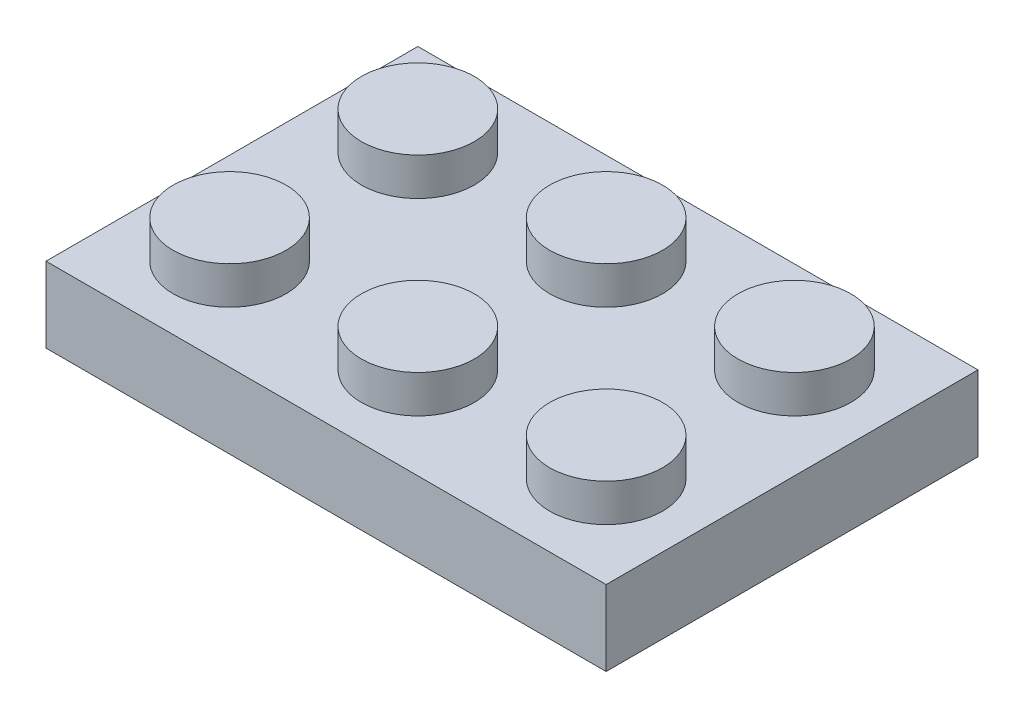
ISO-10303-21;
HEADER;
FILE_DESCRIPTION(('STEP AP214'),'2;1');
FILE_NAME('part.step','',(''),(''),'','','');
FILE_SCHEMA(('AUTOMOTIVE_DESIGN { 1 0 10303 214 1 1 1 1 }'));
ENDSEC;
DATA;
#1=APPLICATION_CONTEXT('core data for automotive mechanical design processes');
#2=APPLICATION_PROTOCOL_DEFINITION('international standard','automotive_design',2000,#1);
#3=PRODUCT_CONTEXT('',#1,'mechanical');
#4=PRODUCT('Part','Part','',(#3));
#5=PRODUCT_RELATED_PRODUCT_CATEGORY('part','',(#4));
#6=PRODUCT_DEFINITION_FORMATION('','',#4);
#7=PRODUCT_DEFINITION_CONTEXT('part definition',#1,'design');
#8=PRODUCT_DEFINITION('design','',#6,#7);
#9=PRODUCT_DEFINITION_SHAPE('','',#8);
#10=(LENGTH_UNIT() NAMED_UNIT(*) SI_UNIT(.MILLI.,.METRE.));
#11=(NAMED_UNIT(*) PLANE_ANGLE_UNIT() SI_UNIT($,.RADIAN.));
#12=(NAMED_UNIT(*) SI_UNIT($,.STERADIAN.) SOLID_ANGLE_UNIT());
#13=UNCERTAINTY_MEASURE_WITH_UNIT(LENGTH_MEASURE(1.E-05),#10,'distance_accuracy_value','');
#14=(GEOMETRIC_REPRESENTATION_CONTEXT(3) GLOBAL_UNCERTAINTY_ASSIGNED_CONTEXT((#13)) GLOBAL_UNIT_ASSIGNED_CONTEXT((#10,
#11,#12)) REPRESENTATION_CONTEXT('',''));
#15=CARTESIAN_POINT('',(0.,0.,0.));
#16=DIRECTION('',(0.,0.,1.));
#17=DIRECTION('',(1.,0.,0.));
#18=AXIS2_PLACEMENT_3D('',#15,#16,#17);
#19=CARTESIAN_POINT('',(0.,0.,-15.8));
#20=DIRECTION('',(0.,-1.,0.));
#21=DIRECTION('',(0.,0.,-1.));
#22=AXIS2_PLACEMENT_3D('',#19,#20,#21);
#23=PLANE('',#22);
#24=DIRECTION('',(1.,0.,0.));
#25=VECTOR('',#24,1.);
#26=CARTESIAN_POINT('',(0.,0.,0.));
#27=LINE('',#26,#25);
#28=CARTESIAN_POINT('',(0.,0.,0.));
#29=VERTEX_POINT('',#28);
#30=CARTESIAN_POINT('',(23.8,0.,0.));
#31=VERTEX_POINT('',#30);
#32=EDGE_CURVE('E205',#29,#31,#27,.T.);
#33=ORIENTED_EDGE('',*,*,#32,.F.);
#34=DIRECTION('',(0.,0.,1.));
#35=VECTOR('',#34,1.);
#36=CARTESIAN_POINT('',(0.,0.,-15.8));
#37=LINE('',#36,#35);
#38=CARTESIAN_POINT('',(0.,0.,-15.8));
#39=VERTEX_POINT('',#38);
#40=EDGE_CURVE('E88',#39,#29,#37,.T.);
#41=ORIENTED_EDGE('',*,*,#40,.F.);
#42=DIRECTION('',(1.,0.,0.));
#43=VECTOR('',#42,1.);
#44=CARTESIAN_POINT('',(0.,0.,-15.8));
#45=LINE('',#44,#43);
#46=CARTESIAN_POINT('',(23.8,0.,-15.8));
#47=VERTEX_POINT('',#46);
#48=EDGE_CURVE('E195',#39,#47,#45,.T.);
#49=ORIENTED_EDGE('',*,*,#48,.T.);
#50=DIRECTION('',(0.,0.,1.));
#51=VECTOR('',#50,1.);
#52=CARTESIAN_POINT('',(23.8,0.,-15.8));
#53=LINE('',#52,#51);
#54=EDGE_CURVE('E217',#47,#31,#53,.T.);
#55=ORIENTED_EDGE('',*,*,#54,.T.);
#56=EDGE_LOOP('',(#33,#41,#49,#55));
#57=FACE_BOUND('',#56,.T.);
#58=DIRECTION('',(0.,0.,1.));
#59=VECTOR('',#58,1.);
#60=CARTESIAN_POINT('',(1.2,0.,-15.8));
#61=LINE('',#60,#59);
#62=CARTESIAN_POINT('',(1.2,0.,-14.6));
#63=VERTEX_POINT('',#62);
#64=CARTESIAN_POINT('',(1.2,0.,-1.2));
#65=VERTEX_POINT('',#64);
#66=EDGE_CURVE('E133',#63,#65,#61,.T.);
#67=ORIENTED_EDGE('',*,*,#66,.T.);
#68=DIRECTION('',(1.,0.,0.));
#69=VECTOR('',#68,1.);
#70=CARTESIAN_POINT('',(0.,0.,-1.2));
#71=LINE('',#70,#69);
#72=CARTESIAN_POINT('',(22.6,0.,-1.2));
#73=VERTEX_POINT('',#72);
#74=EDGE_CURVE('E162',#65,#73,#71,.T.);
#75=ORIENTED_EDGE('',*,*,#74,.T.);
#76=DIRECTION('',(0.,0.,1.));
#77=VECTOR('',#76,1.);
#78=CARTESIAN_POINT('',(22.6,0.,-15.8));
#79=LINE('',#78,#77);
#80=CARTESIAN_POINT('',(22.6,0.,-14.6));
#81=VERTEX_POINT('',#80);
#82=EDGE_CURVE('E124',#81,#73,#79,.T.);
#83=ORIENTED_EDGE('',*,*,#82,.F.);
#84=DIRECTION('',(1.,0.,0.));
#85=VECTOR('',#84,1.);
#86=CARTESIAN_POINT('',(0.,0.,-14.6));
#87=LINE('',#86,#85);
#88=EDGE_CURVE('E53',#63,#81,#87,.T.);
#89=ORIENTED_EDGE('',*,*,#88,.F.);
#90=EDGE_LOOP('',(#67,#75,#83,#89));
#91=FACE_BOUND('',#90,.T.);
#92=ADVANCED_FACE('F38',(#57,#91),#23,.T.);
#93=CARTESIAN_POINT('',(19.9,4.8,-11.9));
#94=DIRECTION('',(0.,1.,0.));
#95=DIRECTION('',(0.,0.,1.));
#96=AXIS2_PLACEMENT_3D('',#93,#94,#95);
#97=PLANE('',#96);
#98=CARTESIAN_POINT('',(19.9,4.8,-11.9));
#99=DIRECTION('',(0.,1.,0.));
#100=DIRECTION('',(0.,0.,1.));
#101=AXIS2_PLACEMENT_3D('',#98,#99,#100);
#102=CIRCLE('',#101,2.4);
#103=CARTESIAN_POINT('',(19.9,4.8,-9.5));
#104=VERTEX_POINT('',#103);
#105=EDGE_CURVE('E240',#104,#104,#102,.T.);
#106=ORIENTED_EDGE('',*,*,#105,.T.);
#107=EDGE_LOOP('',(#106));
#108=FACE_BOUND('',#107,.T.);
#109=ADVANCED_FACE('F40',(#108),#97,.T.);
#110=CARTESIAN_POINT('',(19.9,4.8,-11.9));
#111=DIRECTION('',(0.,-1.,0.));
#112=DIRECTION('',(0.,0.,-1.));
#113=AXIS2_PLACEMENT_3D('',#110,#111,#112);
#114=CYLINDRICAL_SURFACE('',#113,2.4);
#115=ORIENTED_EDGE('',*,*,#105,.F.);
#116=EDGE_LOOP('',(#115));
#117=FACE_BOUND('',#116,.T.);
#118=CARTESIAN_POINT('',(19.9,3.2,-11.9));
#119=DIRECTION('',(0.,1.,0.));
#120=DIRECTION('',(0.,0.,1.));
#121=AXIS2_PLACEMENT_3D('',#118,#119,#120);
#122=CIRCLE('',#121,2.4);
#123=CARTESIAN_POINT('',(19.9,3.2,-9.5));
#124=VERTEX_POINT('',#123);
#125=EDGE_CURVE('E237',#124,#124,#122,.T.);
#126=ORIENTED_EDGE('',*,*,#125,.T.);
#127=EDGE_LOOP('',(#126));
#128=FACE_BOUND('',#127,.T.);
#129=ADVANCED_FACE('F274',(#117,#128),#114,.T.);
#130=CARTESIAN_POINT('',(19.9,4.8,-3.9));
#131=DIRECTION('',(0.,1.,0.));
#132=DIRECTION('',(0.,0.,1.));
#133=AXIS2_PLACEMENT_3D('',#130,#131,#132);
#134=PLANE('',#133);
#135=CARTESIAN_POINT('',(19.9,4.8,-3.9));
#136=DIRECTION('',(0.,1.,0.));
#137=DIRECTION('',(0.,0.,1.));
#138=AXIS2_PLACEMENT_3D('',#135,#136,#137);
#139=CIRCLE('',#138,2.4);
#140=CARTESIAN_POINT('',(19.9,4.8,-1.5));
#141=VERTEX_POINT('',#140);
#142=EDGE_CURVE('E234',#141,#141,#139,.T.);
#143=ORIENTED_EDGE('',*,*,#142,.T.);
#144=EDGE_LOOP('',(#143));
#145=FACE_BOUND('',#144,.T.);
#146=ADVANCED_FACE('F303',(#145),#134,.T.);
#147=CARTESIAN_POINT('',(19.9,4.8,-3.9));
#148=DIRECTION('',(0.,-1.,0.));
#149=DIRECTION('',(0.,0.,-1.));
#150=AXIS2_PLACEMENT_3D('',#147,#148,#149);
#151=CYLINDRICAL_SURFACE('',#150,2.4);
#152=ORIENTED_EDGE('',*,*,#142,.F.);
#153=EDGE_LOOP('',(#152));
#154=FACE_BOUND('',#153,.T.);
#155=CARTESIAN_POINT('',(19.9,3.2,-3.9));
#156=DIRECTION('',(0.,1.,0.));
#157=DIRECTION('',(0.,0.,1.));
#158=AXIS2_PLACEMENT_3D('',#155,#156,#157);
#159=CIRCLE('',#158,2.4);
#160=CARTESIAN_POINT('',(19.9,3.2,-1.5));
#161=VERTEX_POINT('',#160);
#162=EDGE_CURVE('E231',#161,#161,#159,.T.);
#163=ORIENTED_EDGE('',*,*,#162,.T.);
#164=EDGE_LOOP('',(#163));
#165=FACE_BOUND('',#164,.T.);
#166=ADVANCED_FACE('F299',(#154,#165),#151,.T.);
#167=CARTESIAN_POINT('',(11.9,4.8,-11.9));
#168=DIRECTION('',(0.,1.,0.));
#169=DIRECTION('',(0.,0.,1.));
#170=AXIS2_PLACEMENT_3D('',#167,#168,#169);
#171=PLANE('',#170);
#172=CARTESIAN_POINT('',(11.9,4.8,-11.9));
#173=DIRECTION('',(0.,1.,0.));
#174=DIRECTION('',(0.,0.,1.));
#175=AXIS2_PLACEMENT_3D('',#172,#173,#174);
#176=CIRCLE('',#175,2.4);
#177=CARTESIAN_POINT('',(11.9,4.8,-9.5));
#178=VERTEX_POINT('',#177);
#179=EDGE_CURVE('E228',#178,#178,#176,.T.);
#180=ORIENTED_EDGE('',*,*,#179,.T.);
#181=EDGE_LOOP('',(#180));
#182=FACE_BOUND('',#181,.T.);
#183=ADVANCED_FACE('F295',(#182),#171,.T.);
#184=CARTESIAN_POINT('',(11.9,4.8,-11.9));
#185=DIRECTION('',(0.,-1.,0.));
#186=DIRECTION('',(0.,0.,-1.));
#187=AXIS2_PLACEMENT_3D('',#184,#185,#186);
#188=CYLINDRICAL_SURFACE('',#187,2.4);
#189=ORIENTED_EDGE('',*,*,#179,.F.);
#190=EDGE_LOOP('',(#189));
#191=FACE_BOUND('',#190,.T.);
#192=CARTESIAN_POINT('',(11.9,3.2,-11.9));
#193=DIRECTION('',(0.,1.,0.));
#194=DIRECTION('',(0.,0.,1.));
#195=AXIS2_PLACEMENT_3D('',#192,#193,#194);
#196=CIRCLE('',#195,2.4);
#197=CARTESIAN_POINT('',(11.9,3.2,-9.5));
#198=VERTEX_POINT('',#197);
#199=EDGE_CURVE('E225',#198,#198,#196,.T.);
#200=ORIENTED_EDGE('',*,*,#199,.T.);
#201=EDGE_LOOP('',(#200));
#202=FACE_BOUND('',#201,.T.);
#203=ADVANCED_FACE('F291',(#191,#202),#188,.T.);
#204=CARTESIAN_POINT('',(11.9,4.8,-3.9));
#205=DIRECTION('',(0.,1.,0.));
#206=DIRECTION('',(0.,0.,1.));
#207=AXIS2_PLACEMENT_3D('',#204,#205,#206);
#208=PLANE('',#207);
#209=CARTESIAN_POINT('',(11.9,4.8,-3.9));
#210=DIRECTION('',(0.,1.,0.));
#211=DIRECTION('',(0.,0.,1.));
#212=AXIS2_PLACEMENT_3D('',#209,#210,#211);
#213=CIRCLE('',#212,2.4);
#214=CARTESIAN_POINT('',(11.9,4.8,-1.5));
#215=VERTEX_POINT('',#214);
#216=EDGE_CURVE('E222',#215,#215,#213,.T.);
#217=ORIENTED_EDGE('',*,*,#216,.T.);
#218=EDGE_LOOP('',(#217));
#219=FACE_BOUND('',#218,.T.);
#220=ADVANCED_FACE('F287',(#219),#208,.T.);
#221=CARTESIAN_POINT('',(11.9,4.8,-3.9));
#222=DIRECTION('',(0.,-1.,0.));
#223=DIRECTION('',(0.,0.,-1.));
#224=AXIS2_PLACEMENT_3D('',#221,#222,#223);
#225=CYLINDRICAL_SURFACE('',#224,2.4);
#226=ORIENTED_EDGE('',*,*,#216,.F.);
#227=EDGE_LOOP('',(#226));
#228=FACE_BOUND('',#227,.T.);
#229=CARTESIAN_POINT('',(11.9,3.2,-3.9));
#230=DIRECTION('',(0.,1.,0.));
#231=DIRECTION('',(0.,0.,1.));
#232=AXIS2_PLACEMENT_3D('',#229,#230,#231);
#233=CIRCLE('',#232,2.4);
#234=CARTESIAN_POINT('',(11.9,3.2,-1.5));
#235=VERTEX_POINT('',#234);
#236=EDGE_CURVE('E214',#235,#235,#233,.T.);
#237=ORIENTED_EDGE('',*,*,#236,.T.);
#238=EDGE_LOOP('',(#237));
#239=FACE_BOUND('',#238,.T.);
#240=ADVANCED_FACE('F284',(#228,#239),#225,.T.);
#241=CARTESIAN_POINT('',(0.,0.,-15.8));
#242=DIRECTION('',(-1.,0.,0.));
#243=DIRECTION('',(0.,0.,1.));
#244=AXIS2_PLACEMENT_3D('',#241,#242,#243);
#245=PLANE('',#244);
#246=DIRECTION('',(0.,-1.,0.));
#247=VECTOR('',#246,1.);
#248=CARTESIAN_POINT('',(0.,0.,0.));
#249=LINE('',#248,#247);
#250=CARTESIAN_POINT('',(0.,3.2,0.));
#251=VERTEX_POINT('',#250);
#252=EDGE_CURVE('E190',#251,#29,#249,.T.);
#253=ORIENTED_EDGE('',*,*,#252,.F.);
#254=DIRECTION('',(0.,0.,1.));
#255=VECTOR('',#254,1.);
#256=CARTESIAN_POINT('',(0.,3.2,-15.8));
#257=LINE('',#256,#255);
#258=CARTESIAN_POINT('',(0.,3.2,-15.8));
#259=VERTEX_POINT('',#258);
#260=EDGE_CURVE('E62',#259,#251,#257,.T.);
#261=ORIENTED_EDGE('',*,*,#260,.F.);
#262=DIRECTION('',(0.,-1.,0.));
#263=VECTOR('',#262,1.);
#264=CARTESIAN_POINT('',(0.,0.,-15.8));
#265=LINE('',#264,#263);
#266=EDGE_CURVE('E193',#259,#39,#265,.T.);
#267=ORIENTED_EDGE('',*,*,#266,.T.);
#268=ORIENTED_EDGE('',*,*,#40,.T.);
#269=EDGE_LOOP('',(#253,#261,#267,#268));
#270=FACE_BOUND('',#269,.T.);
#271=ADVANCED_FACE('F280',(#270),#245,.T.);
#272=CARTESIAN_POINT('',(0.,3.2,-15.8));
#273=DIRECTION('',(0.,1.,0.));
#274=DIRECTION('',(0.,0.,1.));
#275=AXIS2_PLACEMENT_3D('',#272,#273,#274);
#276=PLANE('',#275);
#277=CARTESIAN_POINT('',(3.9,3.2,-11.9));
#278=DIRECTION('',(0.,1.,0.));
#279=DIRECTION('',(0.,0.,1.));
#280=AXIS2_PLACEMENT_3D('',#277,#278,#279);
#281=CIRCLE('',#280,2.4);
#282=CARTESIAN_POINT('',(3.9,3.2,-9.5));
#283=VERTEX_POINT('',#282);
#284=EDGE_CURVE('E179',#283,#283,#281,.T.);
#285=ORIENTED_EDGE('',*,*,#284,.F.);
#286=EDGE_LOOP('',(#285));
#287=FACE_BOUND('',#286,.T.);
#288=CARTESIAN_POINT('',(3.9,3.2,-3.9));
#289=DIRECTION('',(0.,1.,0.));
#290=DIRECTION('',(0.,0.,1.));
#291=AXIS2_PLACEMENT_3D('',#288,#289,#290);
#292=CIRCLE('',#291,2.4);
#293=CARTESIAN_POINT('',(3.9,3.2,-1.5));
#294=VERTEX_POINT('',#293);
#295=EDGE_CURVE('E186',#294,#294,#292,.T.);
#296=ORIENTED_EDGE('',*,*,#295,.F.);
#297=EDGE_LOOP('',(#296));
#298=FACE_BOUND('',#297,.T.);
#299=DIRECTION('',(-1.,0.,0.));
#300=VECTOR('',#299,1.);
#301=CARTESIAN_POINT('',(0.,3.2,0.));
#302=LINE('',#301,#300);
#303=CARTESIAN_POINT('',(23.8,3.2,0.));
#304=VERTEX_POINT('',#303);
#305=EDGE_CURVE('E196',#304,#251,#302,.T.);
#306=ORIENTED_EDGE('',*,*,#305,.F.);
#307=DIRECTION('',(0.,0.,1.));
#308=VECTOR('',#307,1.);
#309=CARTESIAN_POINT('',(23.8,3.2,-15.8));
#310=LINE('',#309,#308);
#311=CARTESIAN_POINT('',(23.8,3.2,-15.8));
#312=VERTEX_POINT('',#311);
#313=EDGE_CURVE('E215',#312,#304,#310,.T.);
#314=ORIENTED_EDGE('',*,*,#313,.F.);
#315=DIRECTION('',(-1.,0.,0.));
#316=VECTOR('',#315,1.);
#317=CARTESIAN_POINT('',(0.,3.2,-15.8));
#318=LINE('',#317,#316);
#319=EDGE_CURVE('E201',#312,#259,#318,.T.);
#320=ORIENTED_EDGE('',*,*,#319,.T.);
#321=ORIENTED_EDGE('',*,*,#260,.T.);
#322=EDGE_LOOP('',(#306,#314,#320,#321));
#323=FACE_BOUND('',#322,.T.);
#324=ORIENTED_EDGE('',*,*,#236,.F.);
#325=EDGE_LOOP('',(#324));
#326=FACE_BOUND('',#325,.T.);
#327=ORIENTED_EDGE('',*,*,#199,.F.);
#328=EDGE_LOOP('',(#327));
#329=FACE_BOUND('',#328,.T.);
#330=ORIENTED_EDGE('',*,*,#162,.F.);
#331=EDGE_LOOP('',(#330));
#332=FACE_BOUND('',#331,.T.);
#333=ORIENTED_EDGE('',*,*,#125,.F.);
#334=EDGE_LOOP('',(#333));
#335=FACE_BOUND('',#334,.T.);
#336=ADVANCED_FACE('F283',(#287,#298,#323,#326,#329,#332,#335),#276,.T.);
#337=CARTESIAN_POINT('',(23.8,0.,-15.8));
#338=DIRECTION('',(1.,0.,0.));
#339=DIRECTION('',(0.,0.,-1.));
#340=AXIS2_PLACEMENT_3D('',#337,#338,#339);
#341=PLANE('',#340);
#342=DIRECTION('',(0.,1.,0.));
#343=VECTOR('',#342,1.);
#344=CARTESIAN_POINT('',(23.8,0.,0.));
#345=LINE('',#344,#343);
#346=EDGE_CURVE('E208',#31,#304,#345,.T.);
#347=ORIENTED_EDGE('',*,*,#346,.F.);
#348=ORIENTED_EDGE('',*,*,#54,.F.);
#349=DIRECTION('',(0.,1.,0.));
#350=VECTOR('',#349,1.);
#351=CARTESIAN_POINT('',(23.8,0.,-15.8));
#352=LINE('',#351,#350);
#353=EDGE_CURVE('E198',#47,#312,#352,.T.);
#354=ORIENTED_EDGE('',*,*,#353,.T.);
#355=ORIENTED_EDGE('',*,*,#313,.T.);
#356=EDGE_LOOP('',(#347,#348,#354,#355));
#357=FACE_BOUND('',#356,.T.);
#358=ADVANCED_FACE('F278',(#357),#341,.T.);
#359=CARTESIAN_POINT('',(0.,0.,-15.8));
#360=DIRECTION('',(0.,0.,-1.));
#361=DIRECTION('',(-1.,0.,0.));
#362=AXIS2_PLACEMENT_3D('',#359,#360,#361);
#363=PLANE('',#362);
#364=ORIENTED_EDGE('',*,*,#266,.F.);
#365=ORIENTED_EDGE('',*,*,#319,.F.);
#366=ORIENTED_EDGE('',*,*,#353,.F.);
#367=ORIENTED_EDGE('',*,*,#48,.F.);
#368=EDGE_LOOP('',(#364,#365,#366,#367));
#369=FACE_BOUND('',#368,.T.);
#370=ADVANCED_FACE('F320',(#369),#363,.T.);
#371=CARTESIAN_POINT('',(0.,0.,0.));
#372=DIRECTION('',(0.,0.,-1.));
#373=DIRECTION('',(-1.,0.,0.));
#374=AXIS2_PLACEMENT_3D('',#371,#372,#373);
#375=PLANE('',#374);
#376=ORIENTED_EDGE('',*,*,#252,.T.);
#377=ORIENTED_EDGE('',*,*,#32,.T.);
#378=ORIENTED_EDGE('',*,*,#346,.T.);
#379=ORIENTED_EDGE('',*,*,#305,.T.);
#380=EDGE_LOOP('',(#376,#377,#378,#379));
#381=FACE_BOUND('',#380,.T.);
#382=ADVANCED_FACE('F325',(#381),#375,.F.);
#383=CARTESIAN_POINT('',(3.9,4.8,-3.9));
#384=DIRECTION('',(0.,-1.,0.));
#385=DIRECTION('',(0.,0.,-1.));
#386=AXIS2_PLACEMENT_3D('',#383,#384,#385);
#387=CYLINDRICAL_SURFACE('',#386,2.4);
#388=CARTESIAN_POINT('',(3.9,4.8,-3.9));
#389=DIRECTION('',(0.,1.,0.));
#390=DIRECTION('',(0.,0.,1.));
#391=AXIS2_PLACEMENT_3D('',#388,#389,#390);
#392=CIRCLE('',#391,2.4);
#393=CARTESIAN_POINT('',(3.9,4.8,-1.5));
#394=VERTEX_POINT('',#393);
#395=EDGE_CURVE('E187',#394,#394,#392,.T.);
#396=ORIENTED_EDGE('',*,*,#395,.F.);
#397=EDGE_LOOP('',(#396));
#398=FACE_BOUND('',#397,.T.);
#399=ORIENTED_EDGE('',*,*,#295,.T.);
#400=EDGE_LOOP('',(#399));
#401=FACE_BOUND('',#400,.T.);
#402=ADVANCED_FACE('F328',(#398,#401),#387,.T.);
#403=CARTESIAN_POINT('',(3.9,4.8,-3.9));
#404=DIRECTION('',(0.,1.,0.));
#405=DIRECTION('',(0.,0.,1.));
#406=AXIS2_PLACEMENT_3D('',#403,#404,#405);
#407=PLANE('',#406);
#408=ORIENTED_EDGE('',*,*,#395,.T.);
#409=EDGE_LOOP('',(#408));
#410=FACE_BOUND('',#409,.T.);
#411=ADVANCED_FACE('F335',(#410),#407,.T.);
#412=CARTESIAN_POINT('',(3.9,4.8,-11.9));
#413=DIRECTION('',(0.,-1.,0.));
#414=DIRECTION('',(0.,0.,-1.));
#415=AXIS2_PLACEMENT_3D('',#412,#413,#414);
#416=CYLINDRICAL_SURFACE('',#415,2.4);
#417=CARTESIAN_POINT('',(3.9,4.8,-11.9));
#418=DIRECTION('',(0.,1.,0.));
#419=DIRECTION('',(0.,0.,1.));
#420=AXIS2_PLACEMENT_3D('',#417,#418,#419);
#421=CIRCLE('',#420,2.4);
#422=CARTESIAN_POINT('',(3.9,4.8,-9.5));
#423=VERTEX_POINT('',#422);
#424=EDGE_CURVE('E182',#423,#423,#421,.T.);
#425=ORIENTED_EDGE('',*,*,#424,.F.);
#426=EDGE_LOOP('',(#425));
#427=FACE_BOUND('',#426,.T.);
#428=ORIENTED_EDGE('',*,*,#284,.T.);
#429=EDGE_LOOP('',(#428));
#430=FACE_BOUND('',#429,.T.);
#431=ADVANCED_FACE('F339',(#427,#430),#416,.T.);
#432=CARTESIAN_POINT('',(3.9,4.8,-11.9));
#433=DIRECTION('',(0.,1.,0.));
#434=DIRECTION('',(0.,0.,1.));
#435=AXIS2_PLACEMENT_3D('',#432,#433,#434);
#436=PLANE('',#435);
#437=ORIENTED_EDGE('',*,*,#424,.T.);
#438=EDGE_LOOP('',(#437));
#439=FACE_BOUND('',#438,.T.);
#440=ADVANCED_FACE('F343',(#439),#436,.T.);
#441=CARTESIAN_POINT('',(19.9,3.6,-11.9));
#442=DIRECTION('',(0.,1.,0.));
#443=DIRECTION('',(0.,0.,1.));
#444=AXIS2_PLACEMENT_3D('',#441,#442,#443);
#445=PLANE('',#444);
#446=CARTESIAN_POINT('',(19.9,3.6,-11.9));
#447=DIRECTION('',(0.,1.,0.));
#448=DIRECTION('',(0.,0.,1.));
#449=AXIS2_PLACEMENT_3D('',#446,#447,#448);
#450=CIRCLE('',#449,1.2);
#451=CARTESIAN_POINT('',(19.9,3.6,-10.7));
#452=VERTEX_POINT('',#451);
#453=EDGE_CURVE('E183',#452,#452,#450,.T.);
#454=ORIENTED_EDGE('',*,*,#453,.F.);
#455=EDGE_LOOP('',(#454));
#456=FACE_BOUND('',#455,.T.);
#457=ADVANCED_FACE('F347',(#456),#445,.F.);
#458=CARTESIAN_POINT('',(19.9,4.8,-11.9));
#459=DIRECTION('',(0.,-1.,0.));
#460=DIRECTION('',(0.,0.,-1.));
#461=AXIS2_PLACEMENT_3D('',#458,#459,#460);
#462=CYLINDRICAL_SURFACE('',#461,1.2);
#463=ORIENTED_EDGE('',*,*,#453,.T.);
#464=EDGE_LOOP('',(#463));
#465=FACE_BOUND('',#464,.T.);
#466=CARTESIAN_POINT('',(19.9,2.,-11.9));
#467=DIRECTION('',(0.,1.,0.));
#468=DIRECTION('',(0.,0.,1.));
#469=AXIS2_PLACEMENT_3D('',#466,#467,#468);
#470=CIRCLE('',#469,1.2);
#471=CARTESIAN_POINT('',(19.9,2.,-10.7));
#472=VERTEX_POINT('',#471);
#473=EDGE_CURVE('E154',#472,#472,#470,.T.);
#474=ORIENTED_EDGE('',*,*,#473,.F.);
#475=EDGE_LOOP('',(#474));
#476=FACE_BOUND('',#475,.T.);
#477=ADVANCED_FACE('F396',(#465,#476),#462,.F.);
#478=CARTESIAN_POINT('',(19.9,3.6,-3.9));
#479=DIRECTION('',(0.,1.,0.));
#480=DIRECTION('',(0.,0.,1.));
#481=AXIS2_PLACEMENT_3D('',#478,#479,#480);
#482=PLANE('',#481);
#483=CARTESIAN_POINT('',(19.9,3.6,-3.9));
#484=DIRECTION('',(0.,1.,0.));
#485=DIRECTION('',(0.,0.,1.));
#486=AXIS2_PLACEMENT_3D('',#483,#484,#485);
#487=CIRCLE('',#486,1.2);
#488=CARTESIAN_POINT('',(19.9,3.6,-2.7));
#489=VERTEX_POINT('',#488);
#490=EDGE_CURVE('E151',#489,#489,#487,.T.);
#491=ORIENTED_EDGE('',*,*,#490,.F.);
#492=EDGE_LOOP('',(#491));
#493=FACE_BOUND('',#492,.T.);
#494=ADVANCED_FACE('F392',(#493),#482,.F.);
#495=CARTESIAN_POINT('',(19.9,4.8,-3.9));
#496=DIRECTION('',(0.,-1.,0.));
#497=DIRECTION('',(0.,0.,-1.));
#498=AXIS2_PLACEMENT_3D('',#495,#496,#497);
#499=CYLINDRICAL_SURFACE('',#498,1.2);
#500=ORIENTED_EDGE('',*,*,#490,.T.);
#501=EDGE_LOOP('',(#500));
#502=FACE_BOUND('',#501,.T.);
#503=CARTESIAN_POINT('',(19.9,2.,-3.9));
#504=DIRECTION('',(0.,1.,0.));
#505=DIRECTION('',(0.,0.,1.));
#506=AXIS2_PLACEMENT_3D('',#503,#504,#505);
#507=CIRCLE('',#506,1.2);
#508=CARTESIAN_POINT('',(19.9,2.,-2.7));
#509=VERTEX_POINT('',#508);
#510=EDGE_CURVE('E148',#509,#509,#507,.T.);
#511=ORIENTED_EDGE('',*,*,#510,.F.);
#512=EDGE_LOOP('',(#511));
#513=FACE_BOUND('',#512,.T.);
#514=ADVANCED_FACE('F388',(#502,#513),#499,.F.);
#515=CARTESIAN_POINT('',(11.9,3.6,-11.9));
#516=DIRECTION('',(0.,1.,0.));
#517=DIRECTION('',(0.,0.,1.));
#518=AXIS2_PLACEMENT_3D('',#515,#516,#517);
#519=PLANE('',#518);
#520=CARTESIAN_POINT('',(11.9,3.6,-11.9));
#521=DIRECTION('',(0.,1.,0.));
#522=DIRECTION('',(0.,0.,1.));
#523=AXIS2_PLACEMENT_3D('',#520,#521,#522);
#524=CIRCLE('',#523,1.2);
#525=CARTESIAN_POINT('',(11.9,3.6,-10.7));
#526=VERTEX_POINT('',#525);
#527=EDGE_CURVE('E147',#526,#526,#524,.T.);
#528=ORIENTED_EDGE('',*,*,#527,.F.);
#529=EDGE_LOOP('',(#528));
#530=FACE_BOUND('',#529,.T.);
#531=ADVANCED_FACE('F384',(#530),#519,.F.);
#532=CARTESIAN_POINT('',(11.9,4.8,-11.9));
#533=DIRECTION('',(0.,-1.,0.));
#534=DIRECTION('',(0.,0.,-1.));
#535=AXIS2_PLACEMENT_3D('',#532,#533,#534);
#536=CYLINDRICAL_SURFACE('',#535,1.2);
#537=ORIENTED_EDGE('',*,*,#527,.T.);
#538=EDGE_LOOP('',(#537));
#539=FACE_BOUND('',#538,.T.);
#540=CARTESIAN_POINT('',(11.9,2.,-11.9));
#541=DIRECTION('',(0.,1.,0.));
#542=DIRECTION('',(0.,0.,1.));
#543=AXIS2_PLACEMENT_3D('',#540,#541,#542);
#544=CIRCLE('',#543,1.2);
#545=CARTESIAN_POINT('',(11.9,2.,-10.7));
#546=VERTEX_POINT('',#545);
#547=EDGE_CURVE('E144',#546,#546,#544,.T.);
#548=ORIENTED_EDGE('',*,*,#547,.F.);
#549=EDGE_LOOP('',(#548));
#550=FACE_BOUND('',#549,.T.);
#551=ADVANCED_FACE('F380',(#539,#550),#536,.F.);
#552=CARTESIAN_POINT('',(11.9,3.6,-3.9));
#553=DIRECTION('',(0.,1.,0.));
#554=DIRECTION('',(0.,0.,1.));
#555=AXIS2_PLACEMENT_3D('',#552,#553,#554);
#556=PLANE('',#555);
#557=CARTESIAN_POINT('',(11.9,3.6,-3.9));
#558=DIRECTION('',(0.,1.,0.));
#559=DIRECTION('',(0.,0.,1.));
#560=AXIS2_PLACEMENT_3D('',#557,#558,#559);
#561=CIRCLE('',#560,1.2);
#562=CARTESIAN_POINT('',(11.9,3.6,-2.7));
#563=VERTEX_POINT('',#562);
#564=EDGE_CURVE('E143',#563,#563,#561,.T.);
#565=ORIENTED_EDGE('',*,*,#564,.F.);
#566=EDGE_LOOP('',(#565));
#567=FACE_BOUND('',#566,.T.);
#568=ADVANCED_FACE('F376',(#567),#556,.F.);
#569=CARTESIAN_POINT('',(11.9,4.8,-3.9));
#570=DIRECTION('',(0.,-1.,0.));
#571=DIRECTION('',(0.,0.,-1.));
#572=AXIS2_PLACEMENT_3D('',#569,#570,#571);
#573=CYLINDRICAL_SURFACE('',#572,1.2);
#574=ORIENTED_EDGE('',*,*,#564,.T.);
#575=EDGE_LOOP('',(#574));
#576=FACE_BOUND('',#575,.T.);
#577=CARTESIAN_POINT('',(11.9,2.,-3.9));
#578=DIRECTION('',(0.,1.,0.));
#579=DIRECTION('',(0.,0.,1.));
#580=AXIS2_PLACEMENT_3D('',#577,#578,#579);
#581=CIRCLE('',#580,1.2);
#582=CARTESIAN_POINT('',(11.9,2.,-2.7));
#583=VERTEX_POINT('',#582);
#584=EDGE_CURVE('E140',#583,#583,#581,.T.);
#585=ORIENTED_EDGE('',*,*,#584,.F.);
#586=EDGE_LOOP('',(#585));
#587=FACE_BOUND('',#586,.T.);
#588=ADVANCED_FACE('F373',(#576,#587),#573,.F.);
#589=CARTESIAN_POINT('',(1.2,0.,-15.8));
#590=DIRECTION('',(-1.,0.,0.));
#591=DIRECTION('',(0.,0.,1.));
#592=AXIS2_PLACEMENT_3D('',#589,#590,#591);
#593=PLANE('',#592);
#594=DIRECTION('',(0.,-1.,0.));
#595=VECTOR('',#594,1.);
#596=CARTESIAN_POINT('',(1.2,0.,-1.2));
#597=LINE('',#596,#595);
#598=CARTESIAN_POINT('',(1.2,2.,-1.2));
#599=VERTEX_POINT('',#598);
#600=EDGE_CURVE('E159',#599,#65,#597,.T.);
#601=ORIENTED_EDGE('',*,*,#600,.T.);
#602=ORIENTED_EDGE('',*,*,#66,.F.);
#603=DIRECTION('',(0.,-1.,0.));
#604=VECTOR('',#603,1.);
#605=CARTESIAN_POINT('',(1.2,0.,-14.6));
#606=LINE('',#605,#604);
#607=CARTESIAN_POINT('',(1.2,2.,-14.6));
#608=VERTEX_POINT('',#607);
#609=EDGE_CURVE('E164',#608,#63,#606,.T.);
#610=ORIENTED_EDGE('',*,*,#609,.F.);
#611=DIRECTION('',(0.,0.,1.));
#612=VECTOR('',#611,1.);
#613=CARTESIAN_POINT('',(1.2,2.,-15.8));
#614=LINE('',#613,#612);
#615=EDGE_CURVE('E123',#608,#599,#614,.T.);
#616=ORIENTED_EDGE('',*,*,#615,.T.);
#617=EDGE_LOOP('',(#601,#602,#610,#616));
#618=FACE_BOUND('',#617,.T.);
#619=ADVANCED_FACE('F250',(#618),#593,.F.);
#620=CARTESIAN_POINT('',(0.,2.,-15.8));
#621=DIRECTION('',(0.,1.,0.));
#622=DIRECTION('',(0.,0.,1.));
#623=AXIS2_PLACEMENT_3D('',#620,#621,#622);
#624=PLANE('',#623);
#625=CARTESIAN_POINT('',(15.9,2.,-7.9));
#626=DIRECTION('',(0.,1.,0.));
#627=DIRECTION('',(0.,0.,1.));
#628=AXIS2_PLACEMENT_3D('',#625,#626,#627);
#629=CIRCLE('',#628,3.25);
#630=CARTESIAN_POINT('',(15.9,2.,-4.65));
#631=VERTEX_POINT('',#630);
#632=EDGE_CURVE('E12',#631,#631,#629,.F.);
#633=ORIENTED_EDGE('',*,*,#632,.F.);
#634=EDGE_LOOP('',(#633));
#635=FACE_BOUND('',#634,.T.);
#636=CARTESIAN_POINT('',(7.9,2.,-7.9));
#637=DIRECTION('',(0.,1.,0.));
#638=DIRECTION('',(0.,0.,1.));
#639=AXIS2_PLACEMENT_3D('',#636,#637,#638);
#640=CIRCLE('',#639,3.25);
#641=CARTESIAN_POINT('',(7.9,2.,-4.65));
#642=VERTEX_POINT('',#641);
#643=EDGE_CURVE('E46',#642,#642,#640,.F.);
#644=ORIENTED_EDGE('',*,*,#643,.F.);
#645=EDGE_LOOP('',(#644));
#646=FACE_BOUND('',#645,.T.);
#647=CARTESIAN_POINT('',(3.9,2.,-11.9));
#648=DIRECTION('',(0.,1.,0.));
#649=DIRECTION('',(0.,0.,1.));
#650=AXIS2_PLACEMENT_3D('',#647,#648,#649);
#651=CIRCLE('',#650,1.2);
#652=CARTESIAN_POINT('',(3.9,2.,-10.7));
#653=VERTEX_POINT('',#652);
#654=EDGE_CURVE('E173',#653,#653,#651,.T.);
#655=ORIENTED_EDGE('',*,*,#654,.T.);
#656=EDGE_LOOP('',(#655));
#657=FACE_BOUND('',#656,.T.);
#658=CARTESIAN_POINT('',(3.9,2.,-3.9));
#659=DIRECTION('',(0.,1.,0.));
#660=DIRECTION('',(0.,0.,1.));
#661=AXIS2_PLACEMENT_3D('',#658,#659,#660);
#662=CIRCLE('',#661,1.2);
#663=CARTESIAN_POINT('',(3.9,2.,-2.7));
#664=VERTEX_POINT('',#663);
#665=EDGE_CURVE('E170',#664,#664,#662,.T.);
#666=ORIENTED_EDGE('',*,*,#665,.T.);
#667=EDGE_LOOP('',(#666));
#668=FACE_BOUND('',#667,.T.);
#669=DIRECTION('',(-1.,0.,0.));
#670=VECTOR('',#669,1.);
#671=CARTESIAN_POINT('',(0.,2.,-1.2));
#672=LINE('',#671,#670);
#673=CARTESIAN_POINT('',(22.6,2.,-1.2));
#674=VERTEX_POINT('',#673);
#675=EDGE_CURVE('E165',#674,#599,#672,.T.);
#676=ORIENTED_EDGE('',*,*,#675,.T.);
#677=ORIENTED_EDGE('',*,*,#615,.F.);
#678=DIRECTION('',(-1.,0.,0.));
#679=VECTOR('',#678,1.);
#680=CARTESIAN_POINT('',(0.,2.,-14.6));
#681=LINE('',#680,#679);
#682=CARTESIAN_POINT('',(22.6,2.,-14.6));
#683=VERTEX_POINT('',#682);
#684=EDGE_CURVE('E128',#683,#608,#681,.T.);
#685=ORIENTED_EDGE('',*,*,#684,.F.);
#686=DIRECTION('',(0.,0.,1.));
#687=VECTOR('',#686,1.);
#688=CARTESIAN_POINT('',(22.6,2.,-15.8));
#689=LINE('',#688,#687);
#690=EDGE_CURVE('E113',#683,#674,#689,.T.);
#691=ORIENTED_EDGE('',*,*,#690,.T.);
#692=EDGE_LOOP('',(#676,#677,#685,#691));
#693=FACE_BOUND('',#692,.T.);
#694=ORIENTED_EDGE('',*,*,#584,.T.);
#695=EDGE_LOOP('',(#694));
#696=FACE_BOUND('',#695,.T.);
#697=ORIENTED_EDGE('',*,*,#547,.T.);
#698=EDGE_LOOP('',(#697));
#699=FACE_BOUND('',#698,.T.);
#700=ORIENTED_EDGE('',*,*,#510,.T.);
#701=EDGE_LOOP('',(#700));
#702=FACE_BOUND('',#701,.T.);
#703=ORIENTED_EDGE('',*,*,#473,.T.);
#704=EDGE_LOOP('',(#703));
#705=FACE_BOUND('',#704,.T.);
#706=ADVANCED_FACE('F130',(#635,#646,#657,#668,#693,#696,#699,#702,#705),#624,.F.);
#707=CARTESIAN_POINT('',(22.6,0.,-15.8));
#708=DIRECTION('',(1.,0.,0.));
#709=DIRECTION('',(0.,0.,-1.));
#710=AXIS2_PLACEMENT_3D('',#707,#708,#709);
#711=PLANE('',#710);
#712=DIRECTION('',(0.,1.,0.));
#713=VECTOR('',#712,1.);
#714=CARTESIAN_POINT('',(22.6,0.,-1.2));
#715=LINE('',#714,#713);
#716=EDGE_CURVE('E118',#73,#674,#715,.T.);
#717=ORIENTED_EDGE('',*,*,#716,.T.);
#718=ORIENTED_EDGE('',*,*,#690,.F.);
#719=DIRECTION('',(0.,1.,0.));
#720=VECTOR('',#719,1.);
#721=CARTESIAN_POINT('',(22.6,0.,-14.6));
#722=LINE('',#721,#720);
#723=EDGE_CURVE('E115',#81,#683,#722,.T.);
#724=ORIENTED_EDGE('',*,*,#723,.F.);
#725=ORIENTED_EDGE('',*,*,#82,.T.);
#726=EDGE_LOOP('',(#717,#718,#724,#725));
#727=FACE_BOUND('',#726,.T.);
#728=ADVANCED_FACE('F114',(#727),#711,.F.);
#729=CARTESIAN_POINT('',(0.,0.,-14.6));
#730=DIRECTION('',(0.,0.,-1.));
#731=DIRECTION('',(-1.,0.,0.));
#732=AXIS2_PLACEMENT_3D('',#729,#730,#731);
#733=PLANE('',#732);
#734=ORIENTED_EDGE('',*,*,#609,.T.);
#735=ORIENTED_EDGE('',*,*,#88,.T.);
#736=ORIENTED_EDGE('',*,*,#723,.T.);
#737=ORIENTED_EDGE('',*,*,#684,.T.);
#738=EDGE_LOOP('',(#734,#735,#736,#737));
#739=FACE_BOUND('',#738,.T.);
#740=ADVANCED_FACE('F127',(#739),#733,.F.);
#741=CARTESIAN_POINT('',(0.,0.,-1.2));
#742=DIRECTION('',(0.,0.,-1.));
#743=DIRECTION('',(-1.,0.,0.));
#744=AXIS2_PLACEMENT_3D('',#741,#742,#743);
#745=PLANE('',#744);
#746=ORIENTED_EDGE('',*,*,#600,.F.);
#747=ORIENTED_EDGE('',*,*,#675,.F.);
#748=ORIENTED_EDGE('',*,*,#716,.F.);
#749=ORIENTED_EDGE('',*,*,#74,.F.);
#750=EDGE_LOOP('',(#746,#747,#748,#749));
#751=FACE_BOUND('',#750,.T.);
#752=ADVANCED_FACE('F266',(#751),#745,.T.);
#753=CARTESIAN_POINT('',(3.9,4.8,-3.9));
#754=DIRECTION('',(0.,-1.,0.));
#755=DIRECTION('',(0.,0.,-1.));
#756=AXIS2_PLACEMENT_3D('',#753,#754,#755);
#757=CYLINDRICAL_SURFACE('',#756,1.2);
#758=CARTESIAN_POINT('',(3.9,3.6,-3.9));
#759=DIRECTION('',(0.,1.,0.));
#760=DIRECTION('',(0.,0.,1.));
#761=AXIS2_PLACEMENT_3D('',#758,#759,#760);
#762=CIRCLE('',#761,1.2);
#763=CARTESIAN_POINT('',(3.9,3.6,-2.7));
#764=VERTEX_POINT('',#763);
#765=EDGE_CURVE('E163',#764,#764,#762,.T.);
#766=ORIENTED_EDGE('',*,*,#765,.T.);
#767=EDGE_LOOP('',(#766));
#768=FACE_BOUND('',#767,.T.);
#769=ORIENTED_EDGE('',*,*,#665,.F.);
#770=EDGE_LOOP('',(#769));
#771=FACE_BOUND('',#770,.T.);
#772=ADVANCED_FACE('F360',(#768,#771),#757,.F.);
#773=CARTESIAN_POINT('',(3.9,3.6,-3.9));
#774=DIRECTION('',(0.,1.,0.));
#775=DIRECTION('',(0.,0.,1.));
#776=AXIS2_PLACEMENT_3D('',#773,#774,#775);
#777=PLANE('',#776);
#778=ORIENTED_EDGE('',*,*,#765,.F.);
#779=EDGE_LOOP('',(#778));
#780=FACE_BOUND('',#779,.T.);
#781=ADVANCED_FACE('F356',(#780),#777,.F.);
#782=CARTESIAN_POINT('',(3.9,4.8,-11.9));
#783=DIRECTION('',(0.,-1.,0.));
#784=DIRECTION('',(0.,0.,-1.));
#785=AXIS2_PLACEMENT_3D('',#782,#783,#784);
#786=CYLINDRICAL_SURFACE('',#785,1.2);
#787=CARTESIAN_POINT('',(3.9,3.6,-11.9));
#788=DIRECTION('',(0.,1.,0.));
#789=DIRECTION('',(0.,0.,1.));
#790=AXIS2_PLACEMENT_3D('',#787,#788,#789);
#791=CIRCLE('',#790,1.2);
#792=CARTESIAN_POINT('',(3.9,3.6,-10.7));
#793=VERTEX_POINT('',#792);
#794=EDGE_CURVE('E171',#793,#793,#791,.T.);
#795=ORIENTED_EDGE('',*,*,#794,.T.);
#796=EDGE_LOOP('',(#795));
#797=FACE_BOUND('',#796,.T.);
#798=ORIENTED_EDGE('',*,*,#654,.F.);
#799=EDGE_LOOP('',(#798));
#800=FACE_BOUND('',#799,.T.);
#801=ADVANCED_FACE('F352',(#797,#800),#786,.F.);
#802=CARTESIAN_POINT('',(3.9,3.6,-11.9));
#803=DIRECTION('',(0.,1.,0.));
#804=DIRECTION('',(0.,0.,1.));
#805=AXIS2_PLACEMENT_3D('',#802,#803,#804);
#806=PLANE('',#805);
#807=ORIENTED_EDGE('',*,*,#794,.F.);
#808=EDGE_LOOP('',(#807));
#809=FACE_BOUND('',#808,.T.);
#810=ADVANCED_FACE('F349',(#809),#806,.F.);
#811=CARTESIAN_POINT('',(7.9,-9.19238815542512,-7.9));
#812=DIRECTION('',(0.,1.,0.));
#813=DIRECTION('',(0.,0.,1.));
#814=AXIS2_PLACEMENT_3D('',#811,#812,#813);
#815=CYLINDRICAL_SURFACE('',#814,3.25);
#816=ORIENTED_EDGE('',*,*,#643,.T.);
#817=EDGE_LOOP('',(#816));
#818=FACE_BOUND('',#817,.T.);
#819=CARTESIAN_POINT('',(7.9,0.200000000000001,-7.9));
#820=DIRECTION('',(0.,-1.,0.));
#821=DIRECTION('',(0.,0.,-1.));
#822=AXIS2_PLACEMENT_3D('',#819,#820,#821);
#823=CIRCLE('',#822,3.25);
#824=CARTESIAN_POINT('',(7.9,0.200000000000001,-11.15));
#825=VERTEX_POINT('',#824);
#826=EDGE_CURVE('E447',#825,#825,#823,.T.);
#827=ORIENTED_EDGE('',*,*,#826,.F.);
#828=EDGE_LOOP('',(#827));
#829=FACE_BOUND('',#828,.T.);
#830=ADVANCED_FACE('F245',(#818,#829),#815,.T.);
#831=CARTESIAN_POINT('',(7.9,-9.19238815542512,-7.9));
#832=DIRECTION('',(0.,1.,0.));
#833=DIRECTION('',(0.,0.,1.));
#834=AXIS2_PLACEMENT_3D('',#831,#832,#833);
#835=CYLINDRICAL_SURFACE('',#834,2.4);
#836=CARTESIAN_POINT('',(7.9,2.,-7.9));
#837=DIRECTION('',(0.,-1.,0.));
#838=DIRECTION('',(0.,0.,-1.));
#839=AXIS2_PLACEMENT_3D('',#836,#837,#838);
#840=CIRCLE('',#839,2.4);
#841=CARTESIAN_POINT('',(7.9,2.,-10.3));
#842=VERTEX_POINT('',#841);
#843=EDGE_CURVE('E441',#842,#842,#840,.T.);
#844=ORIENTED_EDGE('',*,*,#843,.F.);
#845=EDGE_LOOP('',(#844));
#846=FACE_BOUND('',#845,.T.);
#847=CARTESIAN_POINT('',(7.9,0.200000000000001,-7.9));
#848=DIRECTION('',(0.,-1.,0.));
#849=DIRECTION('',(0.,0.,-1.));
#850=AXIS2_PLACEMENT_3D('',#847,#848,#849);
#851=CIRCLE('',#850,2.4);
#852=CARTESIAN_POINT('',(7.9,0.200000000000001,-10.3));
#853=VERTEX_POINT('',#852);
#854=EDGE_CURVE('E437',#853,#853,#851,.T.);
#855=ORIENTED_EDGE('',*,*,#854,.T.);
#856=EDGE_LOOP('',(#855));
#857=FACE_BOUND('',#856,.T.);
#858=ADVANCED_FACE('F406',(#846,#857),#835,.F.);
#859=CARTESIAN_POINT('',(0.,0.2,-15.8));
#860=DIRECTION('',(0.,-1.,0.));
#861=DIRECTION('',(0.,0.,-1.));
#862=AXIS2_PLACEMENT_3D('',#859,#860,#861);
#863=PLANE('',#862);
#864=ORIENTED_EDGE('',*,*,#854,.F.);
#865=EDGE_LOOP('',(#864));
#866=FACE_BOUND('',#865,.T.);
#867=ORIENTED_EDGE('',*,*,#826,.T.);
#868=EDGE_LOOP('',(#867));
#869=FACE_BOUND('',#868,.T.);
#870=ADVANCED_FACE('F409',(#866,#869),#863,.T.);
#871=ORIENTED_EDGE('',*,*,#843,.T.);
#872=EDGE_LOOP('',(#871));
#873=FACE_BOUND('',#872,.T.);
#874=ADVANCED_FACE('F254',(#873),#624,.F.);
#875=CARTESIAN_POINT('',(15.9,-9.19238815542512,-7.9));
#876=DIRECTION('',(0.,1.,0.));
#877=DIRECTION('',(0.,0.,1.));
#878=AXIS2_PLACEMENT_3D('',#875,#876,#877);
#879=CYLINDRICAL_SURFACE('',#878,3.25);
#880=ORIENTED_EDGE('',*,*,#632,.T.);
#881=EDGE_LOOP('',(#880));
#882=FACE_BOUND('',#881,.T.);
#883=CARTESIAN_POINT('',(15.9,0.200000000000001,-7.9));
#884=DIRECTION('',(0.,-1.,0.));
#885=DIRECTION('',(0.,0.,-1.));
#886=AXIS2_PLACEMENT_3D('',#883,#884,#885);
#887=CIRCLE('',#886,3.25);
#888=CARTESIAN_POINT('',(15.9,0.200000000000001,-11.15));
#889=VERTEX_POINT('',#888);
#890=EDGE_CURVE('E435',#889,#889,#887,.T.);
#891=ORIENTED_EDGE('',*,*,#890,.F.);
#892=EDGE_LOOP('',(#891));
#893=FACE_BOUND('',#892,.T.);
#894=ADVANCED_FACE('F414',(#882,#893),#879,.T.);
#895=CARTESIAN_POINT('',(15.9,-9.19238815542512,-7.9));
#896=DIRECTION('',(0.,1.,0.));
#897=DIRECTION('',(0.,0.,1.));
#898=AXIS2_PLACEMENT_3D('',#895,#896,#897);
#899=CYLINDRICAL_SURFACE('',#898,2.4);
#900=CARTESIAN_POINT('',(15.9,2.,-7.9));
#901=DIRECTION('',(0.,-1.,0.));
#902=DIRECTION('',(0.,0.,-1.));
#903=AXIS2_PLACEMENT_3D('',#900,#901,#902);
#904=CIRCLE('',#903,2.4);
#905=CARTESIAN_POINT('',(15.9,2.,-10.3));
#906=VERTEX_POINT('',#905);
#907=EDGE_CURVE('E438',#906,#906,#904,.T.);
#908=ORIENTED_EDGE('',*,*,#907,.F.);
#909=EDGE_LOOP('',(#908));
#910=FACE_BOUND('',#909,.T.);
#911=CARTESIAN_POINT('',(15.9,0.200000000000001,-7.9));
#912=DIRECTION('',(0.,-1.,0.));
#913=DIRECTION('',(0.,0.,-1.));
#914=AXIS2_PLACEMENT_3D('',#911,#912,#913);
#915=CIRCLE('',#914,2.4);
#916=CARTESIAN_POINT('',(15.9,0.200000000000001,-10.3));
#917=VERTEX_POINT('',#916);
#918=EDGE_CURVE('E432',#917,#917,#915,.T.);
#919=ORIENTED_EDGE('',*,*,#918,.T.);
#920=EDGE_LOOP('',(#919));
#921=FACE_BOUND('',#920,.T.);
#922=ADVANCED_FACE('F417',(#910,#921),#899,.F.);
#923=CARTESIAN_POINT('',(0.,0.2,-15.8));
#924=DIRECTION('',(0.,-1.,0.));
#925=DIRECTION('',(0.,0.,-1.));
#926=AXIS2_PLACEMENT_3D('',#923,#924,#925);
#927=PLANE('',#926);
#928=ORIENTED_EDGE('',*,*,#918,.F.);
#929=EDGE_LOOP('',(#928));
#930=FACE_BOUND('',#929,.T.);
#931=ORIENTED_EDGE('',*,*,#890,.T.);
#932=EDGE_LOOP('',(#931));
#933=FACE_BOUND('',#932,.T.);
#934=ADVANCED_FACE('F421',(#930,#933),#927,.T.);
#935=ORIENTED_EDGE('',*,*,#907,.T.);
#936=EDGE_LOOP('',(#935));
#937=FACE_BOUND('',#936,.T.);
#938=ADVANCED_FACE('F253',(#937),#624,.F.);
#939=CLOSED_SHELL('',(#92,#109,#129,#146,#166,#183,#203,#220,#240,#271,#336,#358,#370,#382,#402,
#411,#431,#440,#457,#477,#494,#514,#531,#551,#568,#588,#619,#706,#728,#740,#752,#772,#781,#801,
#810,#830,#858,#870,#874,#894,#922,#934,#938));
#940=MANIFOLD_SOLID_BREP('B2',#939);
#941=ADVANCED_BREP_SHAPE_REPRESENTATION('',(#18,#940),#14);
#942=SHAPE_DEFINITION_REPRESENTATION(#9,#941);
ENDSEC;
END-ISO-10303-21;
